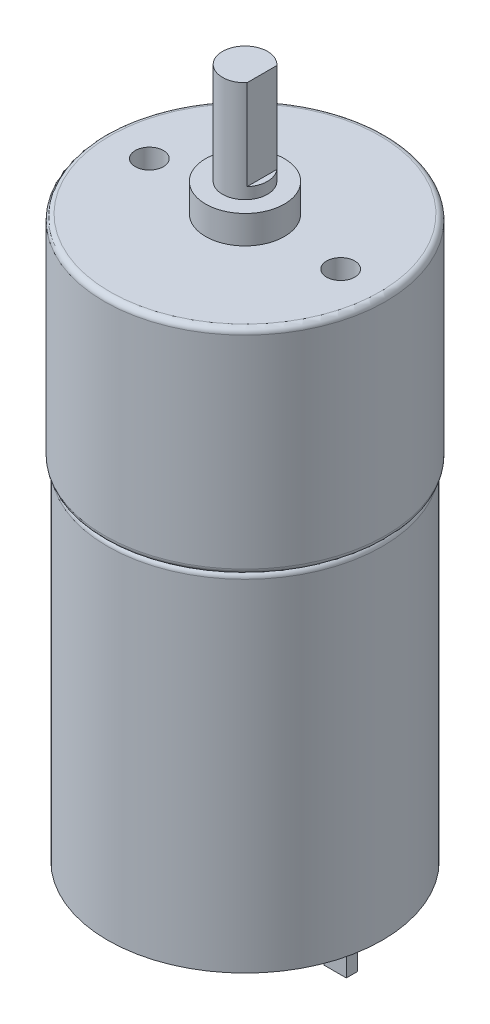
ISO-10303-21;
HEADER;
FILE_DESCRIPTION(('STEP AP214'),'2;1');
FILE_NAME('part.step','',(''),(''),'','','');
FILE_SCHEMA(('AUTOMOTIVE_DESIGN { 1 0 10303 214 1 1 1 1 }'));
ENDSEC;
DATA;
#1=APPLICATION_CONTEXT('core data for automotive mechanical design processes');
#2=APPLICATION_PROTOCOL_DEFINITION('international standard','automotive_design',2000,#1);
#3=PRODUCT_CONTEXT('',#1,'mechanical');
#4=PRODUCT('Part','Part','',(#3));
#5=PRODUCT_RELATED_PRODUCT_CATEGORY('part','',(#4));
#6=PRODUCT_DEFINITION_FORMATION('','',#4);
#7=PRODUCT_DEFINITION_CONTEXT('part definition',#1,'design');
#8=PRODUCT_DEFINITION('design','',#6,#7);
#9=PRODUCT_DEFINITION_SHAPE('','',#8);
#10=(LENGTH_UNIT() NAMED_UNIT(*) SI_UNIT(.MILLI.,.METRE.));
#11=(NAMED_UNIT(*) PLANE_ANGLE_UNIT() SI_UNIT($,.RADIAN.));
#12=(NAMED_UNIT(*) SI_UNIT($,.STERADIAN.) SOLID_ANGLE_UNIT());
#13=UNCERTAINTY_MEASURE_WITH_UNIT(LENGTH_MEASURE(1.E-05),#10,'distance_accuracy_value','');
#14=(GEOMETRIC_REPRESENTATION_CONTEXT(3) GLOBAL_UNCERTAINTY_ASSIGNED_CONTEXT((#13)) GLOBAL_UNIT_ASSIGNED_CONTEXT((#10,
#11,#12)) REPRESENTATION_CONTEXT('',''));
#15=CARTESIAN_POINT('',(0.,0.,0.));
#16=DIRECTION('',(0.,0.,1.));
#17=DIRECTION('',(1.,0.,0.));
#18=AXIS2_PLACEMENT_3D('',#15,#16,#17);
#19=CARTESIAN_POINT('',(0.,0.,0.));
#20=DIRECTION('',(0.,1.,0.));
#21=DIRECTION('',(0.,0.,1.));
#22=AXIS2_PLACEMENT_3D('',#19,#20,#21);
#23=PLANE('',#22);
#24=CARTESIAN_POINT('',(0.,0.,0.));
#25=DIRECTION('',(0.,1.,0.));
#26=DIRECTION('',(0.,0.,1.));
#27=AXIS2_PLACEMENT_3D('',#24,#25,#26);
#28=CIRCLE('',#27,3.25);
#29=CARTESIAN_POINT('',(0.,0.,3.25));
#30=VERTEX_POINT('',#29);
#31=EDGE_CURVE('E11',#30,#30,#28,.F.);
#32=ORIENTED_EDGE('',*,*,#31,.F.);
#33=EDGE_LOOP('',(#32));
#34=FACE_BOUND('',#33,.T.);
#35=DIRECTION('',(0.,0.,-1.));
#36=VECTOR('',#35,1.);
#37=CARTESIAN_POINT('',(-9.5,0.,0.500000000000003));
#38=LINE('',#37,#36);
#39=CARTESIAN_POINT('',(-9.5,0.,0.500000000000003));
#40=VERTEX_POINT('',#39);
#41=CARTESIAN_POINT('',(-9.5,0.,-0.499999999999997));
#42=VERTEX_POINT('',#41);
#43=EDGE_CURVE('E139',#40,#42,#38,.T.);
#44=ORIENTED_EDGE('',*,*,#43,.F.);
#45=DIRECTION('',(-1.,0.,0.));
#46=VECTOR('',#45,1.);
#47=CARTESIAN_POINT('',(-7.5,0.,0.500000000000003));
#48=LINE('',#47,#46);
#49=CARTESIAN_POINT('',(-7.5,0.,0.500000000000003));
#50=VERTEX_POINT('',#49);
#51=EDGE_CURVE('E182',#50,#40,#48,.T.);
#52=ORIENTED_EDGE('',*,*,#51,.F.);
#53=DIRECTION('',(0.,0.,1.));
#54=VECTOR('',#53,1.);
#55=CARTESIAN_POINT('',(-7.5,0.,0.500000000000003));
#56=LINE('',#55,#54);
#57=CARTESIAN_POINT('',(-7.5,0.,-0.499999999999997));
#58=VERTEX_POINT('',#57);
#59=EDGE_CURVE('E199',#58,#50,#56,.T.);
#60=ORIENTED_EDGE('',*,*,#59,.F.);
#61=DIRECTION('',(1.,0.,0.));
#62=VECTOR('',#61,1.);
#63=CARTESIAN_POINT('',(-7.5,0.,-0.499999999999997));
#64=LINE('',#63,#62);
#65=EDGE_CURVE('E195',#42,#58,#64,.T.);
#66=ORIENTED_EDGE('',*,*,#65,.F.);
#67=EDGE_LOOP('',(#44,#52,#60,#66));
#68=FACE_BOUND('',#67,.T.);
#69=CARTESIAN_POINT('',(0.,0.,0.));
#70=DIRECTION('',(0.,1.,0.));
#71=DIRECTION('',(0.,0.,1.));
#72=AXIS2_PLACEMENT_3D('',#69,#70,#71);
#73=CIRCLE('',#72,12.2);
#74=CARTESIAN_POINT('',(0.,0.,-12.2));
#75=VERTEX_POINT('',#74);
#76=EDGE_CURVE('E268',#75,#75,#73,.T.);
#77=ORIENTED_EDGE('',*,*,#76,.F.);
#78=EDGE_LOOP('',(#77));
#79=FACE_BOUND('',#78,.T.);
#80=DIRECTION('',(0.,0.,-1.));
#81=VECTOR('',#80,1.);
#82=CARTESIAN_POINT('',(7.5,0.,0.500000000000003));
#83=LINE('',#82,#81);
#84=CARTESIAN_POINT('',(7.5,0.,0.500000000000003));
#85=VERTEX_POINT('',#84);
#86=CARTESIAN_POINT('',(7.5,0.,-0.499999999999997));
#87=VERTEX_POINT('',#86);
#88=EDGE_CURVE('E132',#85,#87,#83,.T.);
#89=ORIENTED_EDGE('',*,*,#88,.F.);
#90=DIRECTION('',(-1.,0.,0.));
#91=VECTOR('',#90,1.);
#92=CARTESIAN_POINT('',(7.5,0.,0.500000000000003));
#93=LINE('',#92,#91);
#94=CARTESIAN_POINT('',(9.5,0.,0.500000000000003));
#95=VERTEX_POINT('',#94);
#96=EDGE_CURVE('E134',#95,#85,#93,.T.);
#97=ORIENTED_EDGE('',*,*,#96,.F.);
#98=DIRECTION('',(0.,0.,1.));
#99=VECTOR('',#98,1.);
#100=CARTESIAN_POINT('',(9.5,0.,0.500000000000003));
#101=LINE('',#100,#99);
#102=CARTESIAN_POINT('',(9.5,0.,-0.499999999999997));
#103=VERTEX_POINT('',#102);
#104=EDGE_CURVE('E73',#103,#95,#101,.T.);
#105=ORIENTED_EDGE('',*,*,#104,.F.);
#106=DIRECTION('',(1.,0.,0.));
#107=VECTOR('',#106,1.);
#108=CARTESIAN_POINT('',(7.5,0.,-0.499999999999997));
#109=LINE('',#108,#107);
#110=EDGE_CURVE('E68',#87,#103,#109,.T.);
#111=ORIENTED_EDGE('',*,*,#110,.F.);
#112=EDGE_LOOP('',(#89,#97,#105,#111));
#113=FACE_BOUND('',#112,.T.);
#114=ADVANCED_FACE('F52',(#34,#68,#79,#113),#23,.F.);
#115=CARTESIAN_POINT('',(0.,30.8,0.));
#116=DIRECTION('',(0.,-1.,0.));
#117=DIRECTION('',(0.,0.,-1.));
#118=AXIS2_PLACEMENT_3D('',#115,#116,#117);
#119=CYLINDRICAL_SURFACE('',#118,12.2);
#120=CARTESIAN_POINT('',(0.,30.3,0.));
#121=DIRECTION('',(0.,1.,0.));
#122=DIRECTION('',(0.,0.,1.));
#123=AXIS2_PLACEMENT_3D('',#120,#121,#122);
#124=CIRCLE('',#123,12.2);
#125=CARTESIAN_POINT('',(0.,30.3,-12.2));
#126=VERTEX_POINT('',#125);
#127=EDGE_CURVE('E272',#126,#126,#124,.F.);
#128=CARTESIAN_POINT('',(0.,30.3,-12.2));
#129=CARTESIAN_POINT('',(0.,29.984375,-12.2));
#130=CARTESIAN_POINT('',(0.,29.66875,-12.2));
#131=CARTESIAN_POINT('',(0.,29.0375,-12.2));
#132=CARTESIAN_POINT('',(0.,28.721875,-12.2));
#133=CARTESIAN_POINT('',(0.,28.090625,-12.2));
#134=CARTESIAN_POINT('',(0.,27.775,-12.2));
#135=CARTESIAN_POINT('',(0.,27.14375,-12.2));
#136=CARTESIAN_POINT('',(0.,26.828125,-12.2));
#137=CARTESIAN_POINT('',(0.,26.196875,-12.2));
#138=CARTESIAN_POINT('',(0.,25.88125,-12.2));
#139=CARTESIAN_POINT('',(0.,25.25,-12.2));
#140=CARTESIAN_POINT('',(0.,24.934375,-12.2));
#141=CARTESIAN_POINT('',(0.,24.303125,-12.2));
#142=CARTESIAN_POINT('',(0.,23.9875,-12.2));
#143=CARTESIAN_POINT('',(0.,23.35625,-12.2));
#144=CARTESIAN_POINT('',(0.,23.040625,-12.2));
#145=CARTESIAN_POINT('',(0.,22.409375,-12.2));
#146=CARTESIAN_POINT('',(0.,22.09375,-12.2));
#147=CARTESIAN_POINT('',(0.,21.4625,-12.2));
#148=CARTESIAN_POINT('',(0.,21.146875,-12.2));
#149=CARTESIAN_POINT('',(0.,20.515625,-12.2));
#150=CARTESIAN_POINT('',(0.,20.2,-12.2));
#151=CARTESIAN_POINT('',(0.,19.56875,-12.2));
#152=CARTESIAN_POINT('',(0.,19.253125,-12.2));
#153=CARTESIAN_POINT('',(0.,18.621875,-12.2));
#154=CARTESIAN_POINT('',(0.,18.30625,-12.2));
#155=CARTESIAN_POINT('',(0.,17.675,-12.2));
#156=CARTESIAN_POINT('',(0.,17.359375,-12.2));
#157=CARTESIAN_POINT('',(0.,16.728125,-12.2));
#158=CARTESIAN_POINT('',(0.,16.4125,-12.2));
#159=CARTESIAN_POINT('',(0.,15.78125,-12.2));
#160=CARTESIAN_POINT('',(0.,15.465625,-12.2));
#161=CARTESIAN_POINT('',(0.,14.834375,-12.2));
#162=CARTESIAN_POINT('',(0.,14.51875,-12.2));
#163=CARTESIAN_POINT('',(0.,13.8875,-12.2));
#164=CARTESIAN_POINT('',(0.,13.571875,-12.2));
#165=CARTESIAN_POINT('',(0.,12.940625,-12.2));
#166=CARTESIAN_POINT('',(0.,12.625,-12.2));
#167=CARTESIAN_POINT('',(0.,11.99375,-12.2));
#168=CARTESIAN_POINT('',(0.,11.678125,-12.2));
#169=CARTESIAN_POINT('',(0.,11.046875,-12.2));
#170=CARTESIAN_POINT('',(0.,10.73125,-12.2));
#171=CARTESIAN_POINT('',(0.,10.1,-12.2));
#172=CARTESIAN_POINT('',(0.,9.784375,-12.2));
#173=CARTESIAN_POINT('',(0.,9.153125,-12.2));
#174=CARTESIAN_POINT('',(0.,8.8375,-12.2));
#175=CARTESIAN_POINT('',(0.,8.20625,-12.2));
#176=CARTESIAN_POINT('',(0.,7.890625,-12.2));
#177=CARTESIAN_POINT('',(0.,7.259375,-12.2));
#178=CARTESIAN_POINT('',(0.,6.94375,-12.2));
#179=CARTESIAN_POINT('',(0.,6.3125,-12.2));
#180=CARTESIAN_POINT('',(0.,5.996875,-12.2));
#181=CARTESIAN_POINT('',(0.,5.365625,-12.2));
#182=CARTESIAN_POINT('',(0.,5.05,-12.2));
#183=CARTESIAN_POINT('',(0.,4.41875,-12.2));
#184=CARTESIAN_POINT('',(0.,4.103125,-12.2));
#185=CARTESIAN_POINT('',(0.,3.471875,-12.2));
#186=CARTESIAN_POINT('',(0.,3.15625,-12.2));
#187=CARTESIAN_POINT('',(0.,2.525,-12.2));
#188=CARTESIAN_POINT('',(0.,2.209375,-12.2));
#189=CARTESIAN_POINT('',(0.,1.578125,-12.2));
#190=CARTESIAN_POINT('',(0.,1.2625,-12.2));
#191=CARTESIAN_POINT('',(0.,0.631249999999997,-12.2));
#192=CARTESIAN_POINT('',(0.,0.315624999999997,-12.2));
#193=CARTESIAN_POINT('',(0.,0.,-12.2));
#194=B_SPLINE_CURVE_WITH_KNOTS('',3,(#128,#129,#130,#131,#132,#133,#134,#135,#136,#137,#138,
#139,#140,#141,#142,#143,#144,#145,#146,#147,#148,#149,#150,#151,#152,#153,#154,#155,#156,#157,
#158,#159,#160,#161,#162,#163,#164,#165,#166,#167,#168,#169,#170,#171,#172,#173,#174,#175,#176,
#177,#178,#179,#180,#181,#182,#183,#184,#185,#186,#187,#188,#189,#190,#191,#192,#193),
.UNSPECIFIED.,.F.,.F.,(4,2,2,2,2,2,2,2,2,2,2,2,2,2,2,2,2,2,2,2,2,2,2,2,2,2,2,2,2,2,2,2,4),(0.,
0.946875,1.89375,2.840625,3.7875,4.734375,5.68125,6.628125,7.575,8.521875,9.46875,10.415625,
11.3625,12.309375,13.25625,14.203125,15.15,16.096875,17.04375,17.990625,18.9375,19.884375,
20.83125,21.778125,22.725,23.671875,24.61875,25.565625,26.5125,27.459375,28.40625,29.353125,
30.3),.UNSPECIFIED.);
#195=EDGE_CURVE('BSEAM320',#126,#75,#194,.T.);
#196=ORIENTED_EDGE('',*,*,#127,.T.);
#197=ORIENTED_EDGE('',*,*,#76,.T.);
#198=ORIENTED_EDGE('',*,*,#195,.T.);
#199=ORIENTED_EDGE('',*,*,#195,.F.);
#200=EDGE_LOOP('',(#196,#198,#197,#199));
#201=FACE_BOUND('',#200,.T.);
#202=ADVANCED_FACE('F320',(#201),#119,.T.);
#203=CARTESIAN_POINT('',(0.,30.3,0.));
#204=DIRECTION('',(0.,1.,0.));
#205=DIRECTION('',(0.,0.,1.));
#206=AXIS2_PLACEMENT_3D('',#203,#204,#205);
#207=TOROIDAL_SURFACE('',#206,11.7,0.5);
#208=ORIENTED_EDGE('',*,*,#127,.F.);
#209=EDGE_LOOP('',(#208));
#210=FACE_BOUND('',#209,.T.);
#211=CARTESIAN_POINT('',(0.,30.8,0.));
#212=DIRECTION('',(0.,1.,0.));
#213=DIRECTION('',(0.,0.,1.));
#214=AXIS2_PLACEMENT_3D('',#211,#212,#213);
#215=CIRCLE('',#214,11.7);
#216=CARTESIAN_POINT('',(0.,30.8,11.7));
#217=VERTEX_POINT('',#216);
#218=EDGE_CURVE('E276',#217,#217,#215,.T.);
#219=ORIENTED_EDGE('',*,*,#218,.F.);
#220=EDGE_LOOP('',(#219));
#221=FACE_BOUND('',#220,.T.);
#222=ADVANCED_FACE('F309',(#210,#221),#207,.T.);
#223=CARTESIAN_POINT('',(0.,49.8,0.));
#224=DIRECTION('',(0.,-1.,0.));
#225=DIRECTION('',(0.,0.,-1.));
#226=AXIS2_PLACEMENT_3D('',#223,#224,#225);
#227=CYLINDRICAL_SURFACE('',#226,12.5);
#228=CARTESIAN_POINT('',(0.,49.3,0.));
#229=DIRECTION('',(0.,1.,0.));
#230=DIRECTION('',(0.,0.,1.));
#231=AXIS2_PLACEMENT_3D('',#228,#229,#230);
#232=CIRCLE('',#231,12.5);
#233=CARTESIAN_POINT('',(0.,49.3,12.5));
#234=VERTEX_POINT('',#233);
#235=EDGE_CURVE('E290',#234,#234,#232,.F.);
#236=ORIENTED_EDGE('',*,*,#235,.T.);
#237=EDGE_LOOP('',(#236));
#238=FACE_BOUND('',#237,.T.);
#239=CARTESIAN_POINT('',(0.,31.3,0.));
#240=DIRECTION('',(0.,1.,0.));
#241=DIRECTION('',(0.,0.,1.));
#242=AXIS2_PLACEMENT_3D('',#239,#240,#241);
#243=CIRCLE('',#242,12.5);
#244=CARTESIAN_POINT('',(0.,31.3,12.5));
#245=VERTEX_POINT('',#244);
#246=EDGE_CURVE('E286',#245,#245,#243,.T.);
#247=ORIENTED_EDGE('',*,*,#246,.T.);
#248=EDGE_LOOP('',(#247));
#249=FACE_BOUND('',#248,.T.);
#250=ADVANCED_FACE('F306',(#238,#249),#227,.T.);
#251=CARTESIAN_POINT('',(0.,49.8,0.));
#252=DIRECTION('',(0.,1.,0.));
#253=DIRECTION('',(0.,0.,1.));
#254=AXIS2_PLACEMENT_3D('',#251,#252,#253);
#255=PLANE('',#254);
#256=CARTESIAN_POINT('',(-8.5,49.8,0.));
#257=DIRECTION('',(0.,1.,0.));
#258=DIRECTION('',(0.,0.,1.));
#259=AXIS2_PLACEMENT_3D('',#256,#257,#258);
#260=CIRCLE('',#259,1.24999999999999);
#261=CARTESIAN_POINT('',(-8.5,49.8,1.24999999999999));
#262=VERTEX_POINT('',#261);
#263=EDGE_CURVE('E221',#262,#262,#260,.T.);
#264=ORIENTED_EDGE('',*,*,#263,.F.);
#265=EDGE_LOOP('',(#264));
#266=FACE_BOUND('',#265,.T.);
#267=CARTESIAN_POINT('',(8.5,49.8,0.));
#268=DIRECTION('',(0.,1.,0.));
#269=DIRECTION('',(0.,0.,1.));
#270=AXIS2_PLACEMENT_3D('',#267,#268,#269);
#271=CIRCLE('',#270,1.24999999999999);
#272=CARTESIAN_POINT('',(8.5,49.8,1.24999999999999));
#273=VERTEX_POINT('',#272);
#274=EDGE_CURVE('E229',#273,#273,#271,.T.);
#275=ORIENTED_EDGE('',*,*,#274,.F.);
#276=EDGE_LOOP('',(#275));
#277=FACE_BOUND('',#276,.T.);
#278=CARTESIAN_POINT('',(0.,49.8,0.));
#279=DIRECTION('',(0.,1.,0.));
#280=DIRECTION('',(0.,0.,1.));
#281=AXIS2_PLACEMENT_3D('',#278,#279,#280);
#282=CIRCLE('',#281,12.);
#283=CARTESIAN_POINT('',(0.,49.8,12.));
#284=VERTEX_POINT('',#283);
#285=EDGE_CURVE('E263',#284,#284,#282,.T.);
#286=ORIENTED_EDGE('',*,*,#285,.T.);
#287=EDGE_LOOP('',(#286));
#288=FACE_BOUND('',#287,.T.);
#289=CARTESIAN_POINT('',(0.,49.8,0.));
#290=DIRECTION('',(0.,1.,0.));
#291=DIRECTION('',(0.,0.,1.));
#292=AXIS2_PLACEMENT_3D('',#289,#290,#291);
#293=CIRCLE('',#292,3.5);
#294=CARTESIAN_POINT('',(0.,49.8,3.5));
#295=VERTEX_POINT('',#294);
#296=EDGE_CURVE('E264',#295,#295,#293,.T.);
#297=ORIENTED_EDGE('',*,*,#296,.F.);
#298=EDGE_LOOP('',(#297));
#299=FACE_BOUND('',#298,.T.);
#300=ADVANCED_FACE('F308',(#266,#277,#288,#299),#255,.T.);
#301=CARTESIAN_POINT('',(0.,30.8,0.));
#302=DIRECTION('',(0.,1.,0.));
#303=DIRECTION('',(0.,0.,1.));
#304=AXIS2_PLACEMENT_3D('',#301,#302,#303);
#305=PLANE('',#304);
#306=CARTESIAN_POINT('',(0.,30.8,0.));
#307=DIRECTION('',(0.,1.,0.));
#308=DIRECTION('',(0.,0.,1.));
#309=AXIS2_PLACEMENT_3D('',#306,#307,#308);
#310=CIRCLE('',#309,12.);
#311=CARTESIAN_POINT('',(0.,30.8,12.));
#312=VERTEX_POINT('',#311);
#313=EDGE_CURVE('E61',#312,#312,#310,.F.);
#314=ORIENTED_EDGE('',*,*,#313,.T.);
#315=EDGE_LOOP('',(#314));
#316=FACE_BOUND('',#315,.T.);
#317=ORIENTED_EDGE('',*,*,#218,.T.);
#318=EDGE_LOOP('',(#317));
#319=FACE_BOUND('',#318,.T.);
#320=ADVANCED_FACE('F297',(#316,#319),#305,.F.);
#321=CARTESIAN_POINT('',(0.,52.3,0.));
#322=DIRECTION('',(0.,-1.,0.));
#323=DIRECTION('',(0.,0.,-1.));
#324=AXIS2_PLACEMENT_3D('',#321,#322,#323);
#325=CYLINDRICAL_SURFACE('',#324,3.5);
#326=CARTESIAN_POINT('',(0.,52.3,0.));
#327=DIRECTION('',(0.,1.,0.));
#328=DIRECTION('',(0.,0.,1.));
#329=AXIS2_PLACEMENT_3D('',#326,#327,#328);
#330=CIRCLE('',#329,3.5);
#331=CARTESIAN_POINT('',(0.,52.3,3.5));
#332=VERTEX_POINT('',#331);
#333=EDGE_CURVE('E258',#332,#332,#330,.T.);
#334=ORIENTED_EDGE('',*,*,#333,.F.);
#335=EDGE_LOOP('',(#334));
#336=FACE_BOUND('',#335,.T.);
#337=ORIENTED_EDGE('',*,*,#296,.T.);
#338=EDGE_LOOP('',(#337));
#339=FACE_BOUND('',#338,.T.);
#340=ADVANCED_FACE('F351',(#336,#339),#325,.T.);
#341=CARTESIAN_POINT('',(0.,52.3,0.));
#342=DIRECTION('',(0.,1.,0.));
#343=DIRECTION('',(0.,0.,1.));
#344=AXIS2_PLACEMENT_3D('',#341,#342,#343);
#345=PLANE('',#344);
#346=CARTESIAN_POINT('',(0.,52.3,0.));
#347=DIRECTION('',(0.,1.,0.));
#348=DIRECTION('',(0.,0.,1.));
#349=AXIS2_PLACEMENT_3D('',#346,#347,#348);
#350=CIRCLE('',#349,2.);
#351=CARTESIAN_POINT('',(0.,52.3,2.));
#352=VERTEX_POINT('',#351);
#353=EDGE_CURVE('E259',#352,#352,#350,.T.);
#354=ORIENTED_EDGE('',*,*,#353,.F.);
#355=EDGE_LOOP('',(#354));
#356=FACE_BOUND('',#355,.T.);
#357=ORIENTED_EDGE('',*,*,#333,.T.);
#358=EDGE_LOOP('',(#357));
#359=FACE_BOUND('',#358,.T.);
#360=ADVANCED_FACE('F353',(#356,#359),#345,.T.);
#361=CARTESIAN_POINT('',(0.,61.3,0.));
#362=DIRECTION('',(0.,-1.,0.));
#363=DIRECTION('',(0.,0.,-1.));
#364=AXIS2_PLACEMENT_3D('',#361,#362,#363);
#365=CYLINDRICAL_SURFACE('',#364,2.);
#366=CARTESIAN_POINT('',(0.,61.3,0.));
#367=DIRECTION('',(0.,1.,0.));
#368=DIRECTION('',(0.,0.,1.));
#369=AXIS2_PLACEMENT_3D('',#366,#367,#368);
#370=CIRCLE('',#369,2.);
#371=CARTESIAN_POINT('',(1.5,61.3,-1.3228756555323));
#372=VERTEX_POINT('',#371);
#373=CARTESIAN_POINT('',(1.5,61.3,1.3228756555323));
#374=VERTEX_POINT('',#373);
#375=EDGE_CURVE('E252',#372,#374,#370,.T.);
#376=ORIENTED_EDGE('',*,*,#375,.F.);
#377=DIRECTION('',(0.,1.,0.));
#378=VECTOR('',#377,1.);
#379=CARTESIAN_POINT('',(1.5,53.3,-1.3228756555323));
#380=LINE('',#379,#378);
#381=CARTESIAN_POINT('',(1.5,53.3,-1.3228756555323));
#382=VERTEX_POINT('',#381);
#383=EDGE_CURVE('E245',#382,#372,#380,.T.);
#384=ORIENTED_EDGE('',*,*,#383,.F.);
#385=CARTESIAN_POINT('',(0.,53.3,0.));
#386=DIRECTION('',(0.,1.,0.));
#387=DIRECTION('',(0.,0.,1.));
#388=AXIS2_PLACEMENT_3D('',#385,#386,#387);
#389=CIRCLE('',#388,2.);
#390=CARTESIAN_POINT('',(1.5,53.3,1.3228756555323));
#391=VERTEX_POINT('',#390);
#392=EDGE_CURVE('E238',#391,#382,#389,.T.);
#393=ORIENTED_EDGE('',*,*,#392,.F.);
#394=DIRECTION('',(0.,1.,0.));
#395=VECTOR('',#394,1.);
#396=CARTESIAN_POINT('',(1.5,53.3,1.3228756555323));
#397=LINE('',#396,#395);
#398=EDGE_CURVE('E248',#391,#374,#397,.T.);
#399=ORIENTED_EDGE('',*,*,#398,.T.);
#400=EDGE_LOOP('',(#376,#384,#393,#399));
#401=FACE_BOUND('',#400,.T.);
#402=ORIENTED_EDGE('',*,*,#353,.T.);
#403=EDGE_LOOP('',(#402));
#404=FACE_BOUND('',#403,.T.);
#405=ADVANCED_FACE('F359',(#401,#404),#365,.T.);
#406=CARTESIAN_POINT('',(0.,61.3,0.));
#407=DIRECTION('',(0.,1.,0.));
#408=DIRECTION('',(0.,0.,1.));
#409=AXIS2_PLACEMENT_3D('',#406,#407,#408);
#410=PLANE('',#409);
#411=DIRECTION('',(0.,0.,1.));
#412=VECTOR('',#411,1.);
#413=CARTESIAN_POINT('',(1.5,61.3,-1.3228756555323));
#414=LINE('',#413,#412);
#415=EDGE_CURVE('E237',#372,#374,#414,.T.);
#416=ORIENTED_EDGE('',*,*,#415,.F.);
#417=ORIENTED_EDGE('',*,*,#375,.T.);
#418=EDGE_LOOP('',(#416,#417));
#419=FACE_BOUND('',#418,.T.);
#420=ADVANCED_FACE('F366',(#419),#410,.T.);
#421=CARTESIAN_POINT('',(1.5,53.3,-1.3228756555323));
#422=DIRECTION('',(-1.,0.,0.));
#423=DIRECTION('',(0.,0.,1.));
#424=AXIS2_PLACEMENT_3D('',#421,#422,#423);
#425=PLANE('',#424);
#426=ORIENTED_EDGE('',*,*,#415,.T.);
#427=ORIENTED_EDGE('',*,*,#398,.F.);
#428=DIRECTION('',(0.,0.,1.));
#429=VECTOR('',#428,1.);
#430=CARTESIAN_POINT('',(1.5,53.3,-1.3228756555323));
#431=LINE('',#430,#429);
#432=EDGE_CURVE('E241',#382,#391,#431,.T.);
#433=ORIENTED_EDGE('',*,*,#432,.F.);
#434=ORIENTED_EDGE('',*,*,#383,.T.);
#435=EDGE_LOOP('',(#426,#427,#433,#434));
#436=FACE_BOUND('',#435,.T.);
#437=ADVANCED_FACE('F341',(#436),#425,.F.);
#438=CARTESIAN_POINT('',(0.,53.3,0.));
#439=DIRECTION('',(0.,1.,0.));
#440=DIRECTION('',(0.,0.,1.));
#441=AXIS2_PLACEMENT_3D('',#438,#439,#440);
#442=PLANE('',#441);
#443=ORIENTED_EDGE('',*,*,#392,.T.);
#444=ORIENTED_EDGE('',*,*,#432,.T.);
#445=EDGE_LOOP('',(#443,#444));
#446=FACE_BOUND('',#445,.T.);
#447=ADVANCED_FACE('F337',(#446),#442,.T.);
#448=CARTESIAN_POINT('',(0.,49.3,0.));
#449=DIRECTION('',(0.,1.,0.));
#450=DIRECTION('',(0.,0.,1.));
#451=AXIS2_PLACEMENT_3D('',#448,#449,#450);
#452=TOROIDAL_SURFACE('',#451,12.,0.5);
#453=ORIENTED_EDGE('',*,*,#235,.F.);
#454=EDGE_LOOP('',(#453));
#455=FACE_BOUND('',#454,.T.);
#456=ORIENTED_EDGE('',*,*,#285,.F.);
#457=EDGE_LOOP('',(#456));
#458=FACE_BOUND('',#457,.T.);
#459=ADVANCED_FACE('F303',(#455,#458),#452,.T.);
#460=CARTESIAN_POINT('',(0.,31.3,0.));
#461=DIRECTION('',(0.,1.,0.));
#462=DIRECTION('',(0.,0.,1.));
#463=AXIS2_PLACEMENT_3D('',#460,#461,#462);
#464=TOROIDAL_SURFACE('',#463,12.,0.5);
#465=ORIENTED_EDGE('',*,*,#313,.F.);
#466=EDGE_LOOP('',(#465));
#467=FACE_BOUND('',#466,.T.);
#468=ORIENTED_EDGE('',*,*,#246,.F.);
#469=EDGE_LOOP('',(#468));
#470=FACE_BOUND('',#469,.T.);
#471=ADVANCED_FACE('F54',(#467,#470),#464,.T.);
#472=CARTESIAN_POINT('',(8.5,44.8,0.));
#473=DIRECTION('',(0.,1.,0.));
#474=DIRECTION('',(0.,0.,1.));
#475=AXIS2_PLACEMENT_3D('',#472,#473,#474);
#476=CONICAL_SURFACE('',#475,1.25,1.02974425867665);
#477=CARTESIAN_POINT('',(8.5,44.0489242262155,0.));
#478=VERTEX_POINT('',#477);
#479=VERTEX_LOOP('',#478);
#480=FACE_BOUND('',#479,.T.);
#481=CARTESIAN_POINT('',(8.5,44.8,0.));
#482=DIRECTION('',(0.,1.,0.));
#483=DIRECTION('',(0.,0.,1.));
#484=AXIS2_PLACEMENT_3D('',#481,#482,#483);
#485=CIRCLE('',#484,1.25);
#486=CARTESIAN_POINT('',(8.5,44.8,1.24999999999999));
#487=VERTEX_POINT('',#486);
#488=EDGE_CURVE('E233',#487,#487,#485,.T.);
#489=ORIENTED_EDGE('',*,*,#488,.T.);
#490=EDGE_LOOP('',(#489));
#491=FACE_BOUND('',#490,.T.);
#492=ADVANCED_FACE('F302',(#480,#491),#476,.F.);
#493=CARTESIAN_POINT('',(8.5,49.8,0.));
#494=DIRECTION('',(0.,1.,0.));
#495=DIRECTION('',(0.,0.,1.));
#496=AXIS2_PLACEMENT_3D('',#493,#494,#495);
#497=CYLINDRICAL_SURFACE('',#496,1.24999999999999);
#498=ORIENTED_EDGE('',*,*,#488,.F.);
#499=EDGE_LOOP('',(#498));
#500=FACE_BOUND('',#499,.T.);
#501=ORIENTED_EDGE('',*,*,#274,.T.);
#502=EDGE_LOOP('',(#501));
#503=FACE_BOUND('',#502,.T.);
#504=ADVANCED_FACE('F376',(#500,#503),#497,.F.);
#505=CARTESIAN_POINT('',(-8.5,44.8,0.));
#506=DIRECTION('',(0.,1.,0.));
#507=DIRECTION('',(0.,0.,1.));
#508=AXIS2_PLACEMENT_3D('',#505,#506,#507);
#509=CONICAL_SURFACE('',#508,1.25,1.02974425867665);
#510=CARTESIAN_POINT('',(-8.5,44.0489242262155,0.));
#511=VERTEX_POINT('',#510);
#512=VERTEX_LOOP('',#511);
#513=FACE_BOUND('',#512,.T.);
#514=CARTESIAN_POINT('',(-8.5,44.8,0.));
#515=DIRECTION('',(0.,1.,0.));
#516=DIRECTION('',(0.,0.,1.));
#517=AXIS2_PLACEMENT_3D('',#514,#515,#516);
#518=CIRCLE('',#517,1.25);
#519=CARTESIAN_POINT('',(-8.5,44.8,1.25));
#520=VERTEX_POINT('',#519);
#521=EDGE_CURVE('E225',#520,#520,#518,.T.);
#522=ORIENTED_EDGE('',*,*,#521,.T.);
#523=EDGE_LOOP('',(#522));
#524=FACE_BOUND('',#523,.T.);
#525=ADVANCED_FACE('F380',(#513,#524),#509,.F.);
#526=CARTESIAN_POINT('',(-8.5,49.8,0.));
#527=DIRECTION('',(0.,1.,0.));
#528=DIRECTION('',(0.,0.,1.));
#529=AXIS2_PLACEMENT_3D('',#526,#527,#528);
#530=CYLINDRICAL_SURFACE('',#529,1.24999999999999);
#531=ORIENTED_EDGE('',*,*,#521,.F.);
#532=EDGE_LOOP('',(#531));
#533=FACE_BOUND('',#532,.T.);
#534=ORIENTED_EDGE('',*,*,#263,.T.);
#535=EDGE_LOOP('',(#534));
#536=FACE_BOUND('',#535,.T.);
#537=ADVANCED_FACE('F384',(#533,#536),#530,.F.);
#538=CARTESIAN_POINT('',(-9.5,-4.,0.500000000000003));
#539=DIRECTION('',(1.,0.,0.));
#540=DIRECTION('',(0.,0.,-1.));
#541=AXIS2_PLACEMENT_3D('',#538,#539,#540);
#542=PLANE('',#541);
#543=ORIENTED_EDGE('',*,*,#43,.T.);
#544=DIRECTION('',(0.,1.,0.));
#545=VECTOR('',#544,1.);
#546=CARTESIAN_POINT('',(-9.5,-4.,-0.499999999999997));
#547=LINE('',#546,#545);
#548=CARTESIAN_POINT('',(-9.5,-4.,-0.499999999999997));
#549=VERTEX_POINT('',#548);
#550=EDGE_CURVE('E217',#549,#42,#547,.T.);
#551=ORIENTED_EDGE('',*,*,#550,.F.);
#552=DIRECTION('',(0.,0.,-1.));
#553=VECTOR('',#552,1.);
#554=CARTESIAN_POINT('',(-9.5,-4.,0.500000000000003));
#555=LINE('',#554,#553);
#556=CARTESIAN_POINT('',(-9.5,-4.,0.500000000000003));
#557=VERTEX_POINT('',#556);
#558=EDGE_CURVE('E177',#557,#549,#555,.T.);
#559=ORIENTED_EDGE('',*,*,#558,.F.);
#560=DIRECTION('',(0.,1.,0.));
#561=VECTOR('',#560,1.);
#562=CARTESIAN_POINT('',(-9.5,-4.,0.500000000000003));
#563=LINE('',#562,#561);
#564=EDGE_CURVE('E191',#557,#40,#563,.T.);
#565=ORIENTED_EDGE('',*,*,#564,.T.);
#566=EDGE_LOOP('',(#543,#551,#559,#565));
#567=FACE_BOUND('',#566,.T.);
#568=ADVANCED_FACE('F388',(#567),#542,.F.);
#569=CARTESIAN_POINT('',(-7.5,-4.,-0.499999999999997));
#570=DIRECTION('',(0.,0.,1.));
#571=DIRECTION('',(1.,0.,0.));
#572=AXIS2_PLACEMENT_3D('',#569,#570,#571);
#573=PLANE('',#572);
#574=ORIENTED_EDGE('',*,*,#65,.T.);
#575=DIRECTION('',(0.,1.,0.));
#576=VECTOR('',#575,1.);
#577=CARTESIAN_POINT('',(-7.5,-4.,-0.499999999999997));
#578=LINE('',#577,#576);
#579=CARTESIAN_POINT('',(-7.5,-4.,-0.499999999999997));
#580=VERTEX_POINT('',#579);
#581=EDGE_CURVE('E213',#580,#58,#578,.T.);
#582=ORIENTED_EDGE('',*,*,#581,.F.);
#583=DIRECTION('',(1.,0.,0.));
#584=VECTOR('',#583,1.);
#585=CARTESIAN_POINT('',(-7.5,-4.,-0.499999999999997));
#586=LINE('',#585,#584);
#587=EDGE_CURVE('E181',#549,#580,#586,.T.);
#588=ORIENTED_EDGE('',*,*,#587,.F.);
#589=ORIENTED_EDGE('',*,*,#550,.T.);
#590=EDGE_LOOP('',(#574,#582,#588,#589));
#591=FACE_BOUND('',#590,.T.);
#592=ADVANCED_FACE('F392',(#591),#573,.F.);
#593=CARTESIAN_POINT('',(-7.5,-4.,0.500000000000003));
#594=DIRECTION('',(-1.,0.,0.));
#595=DIRECTION('',(0.,0.,1.));
#596=AXIS2_PLACEMENT_3D('',#593,#594,#595);
#597=PLANE('',#596);
#598=ORIENTED_EDGE('',*,*,#59,.T.);
#599=DIRECTION('',(0.,1.,0.));
#600=VECTOR('',#599,1.);
#601=CARTESIAN_POINT('',(-7.5,-4.,0.500000000000003));
#602=LINE('',#601,#600);
#603=CARTESIAN_POINT('',(-7.5,-4.,0.500000000000003));
#604=VERTEX_POINT('',#603);
#605=EDGE_CURVE('E209',#604,#50,#602,.T.);
#606=ORIENTED_EDGE('',*,*,#605,.F.);
#607=DIRECTION('',(0.,0.,1.));
#608=VECTOR('',#607,1.);
#609=CARTESIAN_POINT('',(-7.5,-4.,0.500000000000003));
#610=LINE('',#609,#608);
#611=EDGE_CURVE('E185',#580,#604,#610,.T.);
#612=ORIENTED_EDGE('',*,*,#611,.F.);
#613=ORIENTED_EDGE('',*,*,#581,.T.);
#614=EDGE_LOOP('',(#598,#606,#612,#613));
#615=FACE_BOUND('',#614,.T.);
#616=ADVANCED_FACE('F396',(#615),#597,.F.);
#617=CARTESIAN_POINT('',(-7.5,-4.,0.500000000000003));
#618=DIRECTION('',(0.,0.,-1.));
#619=DIRECTION('',(-1.,0.,0.));
#620=AXIS2_PLACEMENT_3D('',#617,#618,#619);
#621=PLANE('',#620);
#622=ORIENTED_EDGE('',*,*,#51,.T.);
#623=ORIENTED_EDGE('',*,*,#564,.F.);
#624=DIRECTION('',(-1.,0.,0.));
#625=VECTOR('',#624,1.);
#626=CARTESIAN_POINT('',(-7.5,-4.,0.500000000000003));
#627=LINE('',#626,#625);
#628=EDGE_CURVE('E188',#604,#557,#627,.T.);
#629=ORIENTED_EDGE('',*,*,#628,.F.);
#630=ORIENTED_EDGE('',*,*,#605,.T.);
#631=EDGE_LOOP('',(#622,#623,#629,#630));
#632=FACE_BOUND('',#631,.T.);
#633=ADVANCED_FACE('F400',(#632),#621,.F.);
#634=CARTESIAN_POINT('',(0.,-4.,0.));
#635=DIRECTION('',(0.,1.,0.));
#636=DIRECTION('',(0.,0.,1.));
#637=AXIS2_PLACEMENT_3D('',#634,#635,#636);
#638=PLANE('',#637);
#639=ORIENTED_EDGE('',*,*,#558,.T.);
#640=ORIENTED_EDGE('',*,*,#587,.T.);
#641=ORIENTED_EDGE('',*,*,#611,.T.);
#642=ORIENTED_EDGE('',*,*,#628,.T.);
#643=EDGE_LOOP('',(#639,#640,#641,#642));
#644=FACE_BOUND('',#643,.T.);
#645=ADVANCED_FACE('F404',(#644),#638,.F.);
#646=CARTESIAN_POINT('',(7.5,-4.,0.500000000000003));
#647=DIRECTION('',(1.,0.,0.));
#648=DIRECTION('',(0.,0.,-1.));
#649=AXIS2_PLACEMENT_3D('',#646,#647,#648);
#650=PLANE('',#649);
#651=ORIENTED_EDGE('',*,*,#88,.T.);
#652=DIRECTION('',(0.,1.,0.));
#653=VECTOR('',#652,1.);
#654=CARTESIAN_POINT('',(7.5,-4.,-0.499999999999997));
#655=LINE('',#654,#653);
#656=CARTESIAN_POINT('',(7.5,-4.,-0.499999999999997));
#657=VERTEX_POINT('',#656);
#658=EDGE_CURVE('E436',#657,#87,#655,.T.);
#659=ORIENTED_EDGE('',*,*,#658,.F.);
#660=DIRECTION('',(0.,0.,-1.));
#661=VECTOR('',#660,1.);
#662=CARTESIAN_POINT('',(7.5,-4.,0.500000000000003));
#663=LINE('',#662,#661);
#664=CARTESIAN_POINT('',(7.5,-4.,0.500000000000003));
#665=VERTEX_POINT('',#664);
#666=EDGE_CURVE('E151',#665,#657,#663,.T.);
#667=ORIENTED_EDGE('',*,*,#666,.F.);
#668=DIRECTION('',(0.,1.,0.));
#669=VECTOR('',#668,1.);
#670=CARTESIAN_POINT('',(7.5,-4.,0.500000000000003));
#671=LINE('',#670,#669);
#672=EDGE_CURVE('E146',#665,#85,#671,.T.);
#673=ORIENTED_EDGE('',*,*,#672,.T.);
#674=EDGE_LOOP('',(#651,#659,#667,#673));
#675=FACE_BOUND('',#674,.T.);
#676=ADVANCED_FACE('F153',(#675),#650,.F.);
#677=CARTESIAN_POINT('',(7.5,-4.,-0.499999999999997));
#678=DIRECTION('',(0.,0.,1.));
#679=DIRECTION('',(1.,0.,0.));
#680=AXIS2_PLACEMENT_3D('',#677,#678,#679);
#681=PLANE('',#680);
#682=ORIENTED_EDGE('',*,*,#110,.T.);
#683=DIRECTION('',(0.,1.,0.));
#684=VECTOR('',#683,1.);
#685=CARTESIAN_POINT('',(9.5,-4.,-0.499999999999997));
#686=LINE('',#685,#684);
#687=CARTESIAN_POINT('',(9.5,-4.,-0.499999999999997));
#688=VERTEX_POINT('',#687);
#689=EDGE_CURVE('E162',#688,#103,#686,.T.);
#690=ORIENTED_EDGE('',*,*,#689,.F.);
#691=DIRECTION('',(1.,0.,0.));
#692=VECTOR('',#691,1.);
#693=CARTESIAN_POINT('',(7.5,-4.,-0.499999999999997));
#694=LINE('',#693,#692);
#695=EDGE_CURVE('E172',#657,#688,#694,.T.);
#696=ORIENTED_EDGE('',*,*,#695,.F.);
#697=ORIENTED_EDGE('',*,*,#658,.T.);
#698=EDGE_LOOP('',(#682,#690,#696,#697));
#699=FACE_BOUND('',#698,.T.);
#700=ADVANCED_FACE('F418',(#699),#681,.F.);
#701=CARTESIAN_POINT('',(9.5,-4.,0.500000000000003));
#702=DIRECTION('',(-1.,0.,0.));
#703=DIRECTION('',(0.,0.,1.));
#704=AXIS2_PLACEMENT_3D('',#701,#702,#703);
#705=PLANE('',#704);
#706=ORIENTED_EDGE('',*,*,#104,.T.);
#707=DIRECTION('',(0.,1.,0.));
#708=VECTOR('',#707,1.);
#709=CARTESIAN_POINT('',(9.5,-4.,0.500000000000003));
#710=LINE('',#709,#708);
#711=CARTESIAN_POINT('',(9.5,-4.,0.500000000000003));
#712=VERTEX_POINT('',#711);
#713=EDGE_CURVE('E149',#712,#95,#710,.T.);
#714=ORIENTED_EDGE('',*,*,#713,.F.);
#715=DIRECTION('',(0.,0.,1.));
#716=VECTOR('',#715,1.);
#717=CARTESIAN_POINT('',(9.5,-4.,0.500000000000003));
#718=LINE('',#717,#716);
#719=EDGE_CURVE('E160',#688,#712,#718,.T.);
#720=ORIENTED_EDGE('',*,*,#719,.F.);
#721=ORIENTED_EDGE('',*,*,#689,.T.);
#722=EDGE_LOOP('',(#706,#714,#720,#721));
#723=FACE_BOUND('',#722,.T.);
#724=ADVANCED_FACE('F415',(#723),#705,.F.);
#725=CARTESIAN_POINT('',(7.5,-4.,0.500000000000003));
#726=DIRECTION('',(0.,0.,-1.));
#727=DIRECTION('',(-1.,0.,0.));
#728=AXIS2_PLACEMENT_3D('',#725,#726,#727);
#729=PLANE('',#728);
#730=ORIENTED_EDGE('',*,*,#96,.T.);
#731=ORIENTED_EDGE('',*,*,#672,.F.);
#732=DIRECTION('',(-1.,0.,0.));
#733=VECTOR('',#732,1.);
#734=CARTESIAN_POINT('',(7.5,-4.,0.500000000000003));
#735=LINE('',#734,#733);
#736=EDGE_CURVE('E156',#712,#665,#735,.T.);
#737=ORIENTED_EDGE('',*,*,#736,.F.);
#738=ORIENTED_EDGE('',*,*,#713,.T.);
#739=EDGE_LOOP('',(#730,#731,#737,#738));
#740=FACE_BOUND('',#739,.T.);
#741=ADVANCED_FACE('F144',(#740),#729,.F.);
#742=CARTESIAN_POINT('',(0.,-4.,0.));
#743=DIRECTION('',(0.,-1.,0.));
#744=DIRECTION('',(0.,0.,-1.));
#745=AXIS2_PLACEMENT_3D('',#742,#743,#744);
#746=PLANE('',#745);
#747=ORIENTED_EDGE('',*,*,#666,.T.);
#748=ORIENTED_EDGE('',*,*,#695,.T.);
#749=ORIENTED_EDGE('',*,*,#719,.T.);
#750=ORIENTED_EDGE('',*,*,#736,.T.);
#751=EDGE_LOOP('',(#747,#748,#749,#750));
#752=FACE_BOUND('',#751,.T.);
#753=ADVANCED_FACE('F409',(#752),#746,.T.);
#754=CARTESIAN_POINT('',(0.,-2.,0.));
#755=DIRECTION('',(0.,1.,0.));
#756=DIRECTION('',(0.,0.,1.));
#757=AXIS2_PLACEMENT_3D('',#754,#755,#756);
#758=CYLINDRICAL_SURFACE('',#757,3.25);
#759=CARTESIAN_POINT('',(0.,-2.,0.));
#760=DIRECTION('',(0.,-1.,0.));
#761=DIRECTION('',(0.,0.,-1.));
#762=AXIS2_PLACEMENT_3D('',#759,#760,#761);
#763=CIRCLE('',#762,3.25);
#764=CARTESIAN_POINT('',(0.,-2.,-3.25));
#765=VERTEX_POINT('',#764);
#766=EDGE_CURVE('E434',#765,#765,#763,.T.);
#767=ORIENTED_EDGE('',*,*,#766,.F.);
#768=EDGE_LOOP('',(#767));
#769=FACE_BOUND('',#768,.T.);
#770=ORIENTED_EDGE('',*,*,#31,.T.);
#771=EDGE_LOOP('',(#770));
#772=FACE_BOUND('',#771,.T.);
#773=ADVANCED_FACE('F411',(#769,#772),#758,.T.);
#774=CARTESIAN_POINT('',(0.,-2.,0.));
#775=DIRECTION('',(0.,-1.,0.));
#776=DIRECTION('',(0.,0.,-1.));
#777=AXIS2_PLACEMENT_3D('',#774,#775,#776);
#778=PLANE('',#777);
#779=ORIENTED_EDGE('',*,*,#766,.T.);
#780=EDGE_LOOP('',(#779));
#781=FACE_BOUND('',#780,.T.);
#782=ADVANCED_FACE('F426',(#781),#778,.T.);
#783=CLOSED_SHELL('',(#114,#202,#222,#250,#300,#320,#340,#360,#405,#420,#437,#447,#459,#471,
#492,#504,#525,#537,#568,#592,#616,#633,#645,#676,#700,#724,#741,#753,#773,#782));
#784=MANIFOLD_SOLID_BREP('B2',#783);
#785=ADVANCED_BREP_SHAPE_REPRESENTATION('',(#18,#784),#14);
#786=SHAPE_DEFINITION_REPRESENTATION(#9,#785);
ENDSEC;
END-ISO-10303-21;
